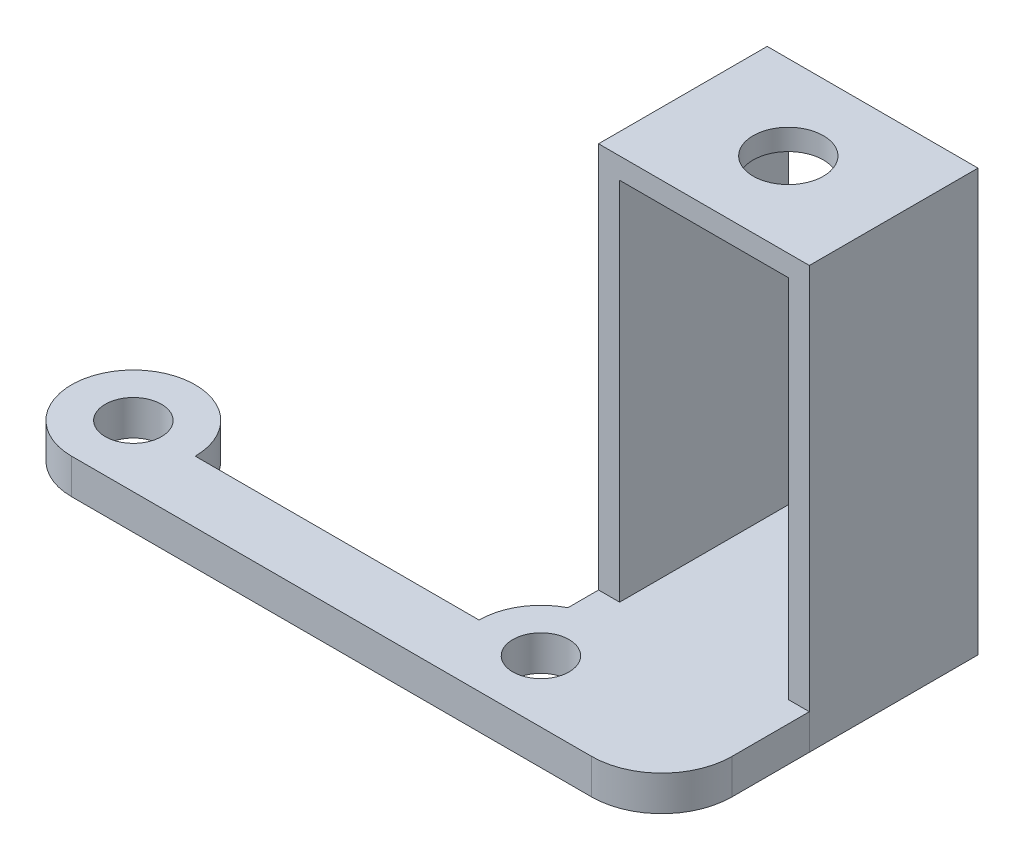
ISO-10303-21;
HEADER;
FILE_DESCRIPTION(('STEP AP214'),'2;1');
FILE_NAME('part.step','',(''),(''),'','','');
FILE_SCHEMA(('AUTOMOTIVE_DESIGN { 1 0 10303 214 1 1 1 1 }'));
ENDSEC;
DATA;
#1=APPLICATION_CONTEXT('core data for automotive mechanical design processes');
#2=APPLICATION_PROTOCOL_DEFINITION('international standard','automotive_design',2000,#1);
#3=PRODUCT_CONTEXT('',#1,'mechanical');
#4=PRODUCT('Part','Part','',(#3));
#5=PRODUCT_RELATED_PRODUCT_CATEGORY('part','',(#4));
#6=PRODUCT_DEFINITION_FORMATION('','',#4);
#7=PRODUCT_DEFINITION_CONTEXT('part definition',#1,'design');
#8=PRODUCT_DEFINITION('design','',#6,#7);
#9=PRODUCT_DEFINITION_SHAPE('','',#8);
#10=(LENGTH_UNIT() NAMED_UNIT(*) SI_UNIT(.MILLI.,.METRE.));
#11=(NAMED_UNIT(*) PLANE_ANGLE_UNIT() SI_UNIT($,.RADIAN.));
#12=(NAMED_UNIT(*) SI_UNIT($,.STERADIAN.) SOLID_ANGLE_UNIT());
#13=UNCERTAINTY_MEASURE_WITH_UNIT(LENGTH_MEASURE(1.E-05),#10,'distance_accuracy_value','');
#14=(GEOMETRIC_REPRESENTATION_CONTEXT(3) GLOBAL_UNCERTAINTY_ASSIGNED_CONTEXT((#13)) GLOBAL_UNIT_ASSIGNED_CONTEXT((#10,
#11,#12)) REPRESENTATION_CONTEXT('',''));
#15=CARTESIAN_POINT('',(0.,0.,0.));
#16=DIRECTION('',(0.,0.,1.));
#17=DIRECTION('',(1.,0.,0.));
#18=AXIS2_PLACEMENT_3D('',#15,#16,#17);
#19=CARTESIAN_POINT('',(55.,0.,-103.282039324994));
#20=DIRECTION('',(-1.,0.,0.));
#21=DIRECTION('',(0.,0.,1.));
#22=AXIS2_PLACEMENT_3D('',#19,#20,#21);
#23=PLANE('',#22);
#24=DIRECTION('',(0.,-1.,0.));
#25=VECTOR('',#24,1.);
#26=CARTESIAN_POINT('',(55.,0.,-36.2));
#27=LINE('',#26,#25);
#28=CARTESIAN_POINT('',(55.,60.,-36.2));
#29=VERTEX_POINT('',#28);
#30=CARTESIAN_POINT('',(55.,0.,-36.2));
#31=VERTEX_POINT('',#30);
#32=EDGE_CURVE('E144',#29,#31,#27,.T.);
#33=ORIENTED_EDGE('',*,*,#32,.F.);
#34=DIRECTION('',(0.,0.,1.));
#35=VECTOR('',#34,1.);
#36=CARTESIAN_POINT('',(55.,60.,-103.282039324994));
#37=LINE('',#36,#35);
#38=CARTESIAN_POINT('',(55.,60.,-12.2));
#39=VERTEX_POINT('',#38);
#40=EDGE_CURVE('E61',#29,#39,#37,.T.);
#41=ORIENTED_EDGE('',*,*,#40,.T.);
#42=DIRECTION('',(0.,-1.,0.));
#43=VECTOR('',#42,1.);
#44=CARTESIAN_POINT('',(55.,0.,-12.2));
#45=LINE('',#44,#43);
#46=CARTESIAN_POINT('',(55.,0.,-12.2));
#47=VERTEX_POINT('',#46);
#48=EDGE_CURVE('E152',#39,#47,#45,.T.);
#49=ORIENTED_EDGE('',*,*,#48,.T.);
#50=DIRECTION('',(0.,0.,1.));
#51=VECTOR('',#50,1.);
#52=CARTESIAN_POINT('',(55.,0.,-103.282039324994));
#53=LINE('',#52,#51);
#54=EDGE_CURVE('E100',#31,#47,#53,.T.);
#55=ORIENTED_EDGE('',*,*,#54,.F.);
#56=EDGE_LOOP('',(#33,#41,#49,#55));
#57=FACE_BOUND('',#56,.T.);
#58=ADVANCED_FACE('F44',(#57),#23,.F.);
#59=CARTESIAN_POINT('',(55.,0.,-103.282039324994));
#60=DIRECTION('',(0.,1.,0.));
#61=DIRECTION('',(0.,0.,1.));
#62=AXIS2_PLACEMENT_3D('',#59,#60,#61);
#63=PLANE('',#62);
#64=DIRECTION('',(-1.,0.,0.));
#65=VECTOR('',#64,1.);
#66=CARTESIAN_POINT('',(55.,0.,-36.2));
#67=LINE('',#66,#65);
#68=CARTESIAN_POINT('',(52.,0.,-36.2));
#69=VERTEX_POINT('',#68);
#70=EDGE_CURVE('E107',#31,#69,#67,.T.);
#71=ORIENTED_EDGE('',*,*,#70,.F.);
#72=ORIENTED_EDGE('',*,*,#54,.T.);
#73=DIRECTION('',(-1.,0.,0.));
#74=VECTOR('',#73,1.);
#75=CARTESIAN_POINT('',(55.,0.,-12.2));
#76=LINE('',#75,#74);
#77=CARTESIAN_POINT('',(52.,0.,-12.2));
#78=VERTEX_POINT('',#77);
#79=EDGE_CURVE('E151',#47,#78,#76,.T.);
#80=ORIENTED_EDGE('',*,*,#79,.T.);
#81=DIRECTION('',(0.,0.,1.));
#82=VECTOR('',#81,1.);
#83=CARTESIAN_POINT('',(52.,0.,-103.282039324994));
#84=LINE('',#83,#82);
#85=EDGE_CURVE('E153',#69,#78,#84,.T.);
#86=ORIENTED_EDGE('',*,*,#85,.F.);
#87=EDGE_LOOP('',(#71,#72,#80,#86));
#88=FACE_BOUND('',#87,.T.);
#89=ADVANCED_FACE('F185',(#88),#63,.F.);
#90=CARTESIAN_POINT('',(52.,57.,-103.282039324994));
#91=DIRECTION('',(1.,0.,0.));
#92=DIRECTION('',(0.,1.,0.));
#93=AXIS2_PLACEMENT_3D('',#90,#91,#92);
#94=PLANE('',#93);
#95=DIRECTION('',(0.,1.,0.));
#96=VECTOR('',#95,1.);
#97=CARTESIAN_POINT('',(52.,57.,-36.2));
#98=LINE('',#97,#96);
#99=CARTESIAN_POINT('',(52.,57.,-36.2));
#100=VERTEX_POINT('',#99);
#101=EDGE_CURVE('E140',#69,#100,#98,.T.);
#102=ORIENTED_EDGE('',*,*,#101,.F.);
#103=ORIENTED_EDGE('',*,*,#85,.T.);
#104=DIRECTION('',(0.,1.,0.));
#105=VECTOR('',#104,1.);
#106=CARTESIAN_POINT('',(52.,57.,-12.2));
#107=LINE('',#106,#105);
#108=CARTESIAN_POINT('',(52.,57.,-12.2));
#109=VERTEX_POINT('',#108);
#110=EDGE_CURVE('E155',#78,#109,#107,.T.);
#111=ORIENTED_EDGE('',*,*,#110,.T.);
#112=DIRECTION('',(0.,0.,1.));
#113=VECTOR('',#112,1.);
#114=CARTESIAN_POINT('',(52.,57.,-103.282039324994));
#115=LINE('',#114,#113);
#116=EDGE_CURVE('E156',#100,#109,#115,.T.);
#117=ORIENTED_EDGE('',*,*,#116,.F.);
#118=EDGE_LOOP('',(#102,#103,#111,#117));
#119=FACE_BOUND('',#118,.T.);
#120=ADVANCED_FACE('F193',(#119),#94,.F.);
#121=CARTESIAN_POINT('',(52.,57.,-103.282039324994));
#122=DIRECTION('',(0.,1.,0.));
#123=DIRECTION('',(0.,0.,1.));
#124=AXIS2_PLACEMENT_3D('',#121,#122,#123);
#125=PLANE('',#124);
#126=CARTESIAN_POINT('',(40.,57.,-24.2));
#127=DIRECTION('',(0.,-1.,0.));
#128=DIRECTION('',(0.,0.,-1.));
#129=AXIS2_PLACEMENT_3D('',#126,#127,#128);
#130=CIRCLE('',#129,5.);
#131=CARTESIAN_POINT('',(40.,57.,-29.2));
#132=VERTEX_POINT('',#131);
#133=EDGE_CURVE('E167',#132,#132,#130,.T.);
#134=ORIENTED_EDGE('',*,*,#133,.F.);
#135=EDGE_LOOP('',(#134));
#136=FACE_BOUND('',#135,.T.);
#137=DIRECTION('',(-1.,0.,0.));
#138=VECTOR('',#137,1.);
#139=CARTESIAN_POINT('',(52.,57.,-36.2));
#140=LINE('',#139,#138);
#141=CARTESIAN_POINT('',(28.,57.,-36.2));
#142=VERTEX_POINT('',#141);
#143=EDGE_CURVE('E135',#100,#142,#140,.T.);
#144=ORIENTED_EDGE('',*,*,#143,.F.);
#145=ORIENTED_EDGE('',*,*,#116,.T.);
#146=DIRECTION('',(-1.,0.,0.));
#147=VECTOR('',#146,1.);
#148=CARTESIAN_POINT('',(52.,57.,-12.2));
#149=LINE('',#148,#147);
#150=CARTESIAN_POINT('',(28.,57.,-12.2));
#151=VERTEX_POINT('',#150);
#152=EDGE_CURVE('E158',#109,#151,#149,.T.);
#153=ORIENTED_EDGE('',*,*,#152,.T.);
#154=DIRECTION('',(0.,0.,1.));
#155=VECTOR('',#154,1.);
#156=CARTESIAN_POINT('',(28.,57.,-103.282039324994));
#157=LINE('',#156,#155);
#158=EDGE_CURVE('E159',#142,#151,#157,.T.);
#159=ORIENTED_EDGE('',*,*,#158,.F.);
#160=EDGE_LOOP('',(#144,#145,#153,#159));
#161=FACE_BOUND('',#160,.T.);
#162=ADVANCED_FACE('F212',(#136,#161),#125,.F.);
#163=CARTESIAN_POINT('',(28.,57.,-103.282039324994));
#164=DIRECTION('',(-1.,0.,0.));
#165=DIRECTION('',(0.,-1.,0.));
#166=AXIS2_PLACEMENT_3D('',#163,#164,#165);
#167=PLANE('',#166);
#168=DIRECTION('',(0.,-1.,0.));
#169=VECTOR('',#168,1.);
#170=CARTESIAN_POINT('',(28.,57.,-36.2));
#171=LINE('',#170,#169);
#172=CARTESIAN_POINT('',(28.,0.,-36.2));
#173=VERTEX_POINT('',#172);
#174=EDGE_CURVE('E133',#142,#173,#171,.T.);
#175=ORIENTED_EDGE('',*,*,#174,.F.);
#176=ORIENTED_EDGE('',*,*,#158,.T.);
#177=DIRECTION('',(0.,-1.,0.));
#178=VECTOR('',#177,1.);
#179=CARTESIAN_POINT('',(28.,57.,-12.2));
#180=LINE('',#179,#178);
#181=CARTESIAN_POINT('',(28.,0.,-12.2));
#182=VERTEX_POINT('',#181);
#183=EDGE_CURVE('E161',#151,#182,#180,.T.);
#184=ORIENTED_EDGE('',*,*,#183,.T.);
#185=DIRECTION('',(0.,0.,1.));
#186=VECTOR('',#185,1.);
#187=CARTESIAN_POINT('',(28.,0.,-103.282039324994));
#188=LINE('',#187,#186);
#189=EDGE_CURVE('E162',#173,#182,#188,.T.);
#190=ORIENTED_EDGE('',*,*,#189,.F.);
#191=EDGE_LOOP('',(#175,#176,#184,#190));
#192=FACE_BOUND('',#191,.T.);
#193=ADVANCED_FACE('F215',(#192),#167,.F.);
#194=CARTESIAN_POINT('',(28.,0.,-103.282039324994));
#195=DIRECTION('',(0.,1.,0.));
#196=DIRECTION('',(0.,0.,1.));
#197=AXIS2_PLACEMENT_3D('',#194,#195,#196);
#198=PLANE('',#197);
#199=DIRECTION('',(-1.,0.,0.));
#200=VECTOR('',#199,1.);
#201=CARTESIAN_POINT('',(28.,0.,-36.2));
#202=LINE('',#201,#200);
#203=CARTESIAN_POINT('',(25.,0.,-36.2));
#204=VERTEX_POINT('',#203);
#205=EDGE_CURVE('E53',#173,#204,#202,.T.);
#206=ORIENTED_EDGE('',*,*,#205,.F.);
#207=ORIENTED_EDGE('',*,*,#189,.T.);
#208=DIRECTION('',(-1.,0.,0.));
#209=VECTOR('',#208,1.);
#210=CARTESIAN_POINT('',(28.,0.,-12.2));
#211=LINE('',#210,#209);
#212=CARTESIAN_POINT('',(25.,0.,-12.2));
#213=VERTEX_POINT('',#212);
#214=EDGE_CURVE('E127',#182,#213,#211,.T.);
#215=ORIENTED_EDGE('',*,*,#214,.T.);
#216=DIRECTION('',(0.,0.,1.));
#217=VECTOR('',#216,1.);
#218=CARTESIAN_POINT('',(25.,0.,-103.282039324994));
#219=LINE('',#218,#217);
#220=EDGE_CURVE('E118',#204,#213,#219,.T.);
#221=ORIENTED_EDGE('',*,*,#220,.F.);
#222=EDGE_LOOP('',(#206,#207,#215,#221));
#223=FACE_BOUND('',#222,.T.);
#224=ADVANCED_FACE('F124',(#223),#198,.F.);
#225=CARTESIAN_POINT('',(25.,0.,-103.282039324994));
#226=DIRECTION('',(1.,0.,0.));
#227=DIRECTION('',(0.,0.,-1.));
#228=AXIS2_PLACEMENT_3D('',#225,#226,#227);
#229=PLANE('',#228);
#230=DIRECTION('',(0.,1.,0.));
#231=VECTOR('',#230,1.);
#232=CARTESIAN_POINT('',(25.,0.,-36.2));
#233=LINE('',#232,#231);
#234=CARTESIAN_POINT('',(25.,60.,-36.2));
#235=VERTEX_POINT('',#234);
#236=EDGE_CURVE('E12',#204,#235,#233,.T.);
#237=ORIENTED_EDGE('',*,*,#236,.F.);
#238=ORIENTED_EDGE('',*,*,#220,.T.);
#239=DIRECTION('',(0.,1.,0.));
#240=VECTOR('',#239,1.);
#241=CARTESIAN_POINT('',(25.,0.,-12.2));
#242=LINE('',#241,#240);
#243=CARTESIAN_POINT('',(25.,60.,-12.2));
#244=VERTEX_POINT('',#243);
#245=EDGE_CURVE('E129',#213,#244,#242,.T.);
#246=ORIENTED_EDGE('',*,*,#245,.T.);
#247=DIRECTION('',(0.,0.,1.));
#248=VECTOR('',#247,1.);
#249=CARTESIAN_POINT('',(25.,60.,-103.282039324994));
#250=LINE('',#249,#248);
#251=EDGE_CURVE('E67',#235,#244,#250,.T.);
#252=ORIENTED_EDGE('',*,*,#251,.F.);
#253=EDGE_LOOP('',(#237,#238,#246,#252));
#254=FACE_BOUND('',#253,.T.);
#255=ADVANCED_FACE('F117',(#254),#229,.F.);
#256=CARTESIAN_POINT('',(55.,60.,-103.282039324994));
#257=DIRECTION('',(0.,-1.,0.));
#258=DIRECTION('',(0.,0.,-1.));
#259=AXIS2_PLACEMENT_3D('',#256,#257,#258);
#260=PLANE('',#259);
#261=CARTESIAN_POINT('',(40.,60.,-24.2));
#262=DIRECTION('',(0.,-1.,0.));
#263=DIRECTION('',(0.,0.,-1.));
#264=AXIS2_PLACEMENT_3D('',#261,#262,#263);
#265=CIRCLE('',#264,5.);
#266=CARTESIAN_POINT('',(40.,60.,-29.2));
#267=VERTEX_POINT('',#266);
#268=EDGE_CURVE('E48',#267,#267,#265,.T.);
#269=ORIENTED_EDGE('',*,*,#268,.T.);
#270=EDGE_LOOP('',(#269));
#271=FACE_BOUND('',#270,.T.);
#272=DIRECTION('',(1.,0.,0.));
#273=VECTOR('',#272,1.);
#274=CARTESIAN_POINT('',(55.,60.,-36.2));
#275=LINE('',#274,#273);
#276=EDGE_CURVE('E147',#235,#29,#275,.T.);
#277=ORIENTED_EDGE('',*,*,#276,.F.);
#278=ORIENTED_EDGE('',*,*,#251,.T.);
#279=DIRECTION('',(1.,0.,0.));
#280=VECTOR('',#279,1.);
#281=CARTESIAN_POINT('',(55.,60.,-12.2));
#282=LINE('',#281,#280);
#283=EDGE_CURVE('E149',#244,#39,#282,.T.);
#284=ORIENTED_EDGE('',*,*,#283,.T.);
#285=ORIENTED_EDGE('',*,*,#40,.F.);
#286=EDGE_LOOP('',(#277,#278,#284,#285));
#287=FACE_BOUND('',#286,.T.);
#288=ADVANCED_FACE('F195',(#271,#287),#260,.F.);
#289=CARTESIAN_POINT('',(0.,0.,-12.2));
#290=DIRECTION('',(0.,0.,1.));
#291=DIRECTION('',(1.,0.,0.));
#292=AXIS2_PLACEMENT_3D('',#289,#290,#291);
#293=PLANE('',#292);
#294=ORIENTED_EDGE('',*,*,#48,.F.);
#295=ORIENTED_EDGE('',*,*,#283,.F.);
#296=ORIENTED_EDGE('',*,*,#245,.F.);
#297=ORIENTED_EDGE('',*,*,#214,.F.);
#298=ORIENTED_EDGE('',*,*,#183,.F.);
#299=ORIENTED_EDGE('',*,*,#152,.F.);
#300=ORIENTED_EDGE('',*,*,#110,.F.);
#301=ORIENTED_EDGE('',*,*,#79,.F.);
#302=EDGE_LOOP('',(#294,#295,#296,#297,#298,#299,#300,#301));
#303=FACE_BOUND('',#302,.T.);
#304=ADVANCED_FACE('F189',(#303),#293,.T.);
#305=CARTESIAN_POINT('',(0.,59.0832691319598,-36.2));
#306=DIRECTION('',(0.,0.,-1.));
#307=DIRECTION('',(-1.,0.,0.));
#308=AXIS2_PLACEMENT_3D('',#305,#306,#307);
#309=PLANE('',#308);
#310=ORIENTED_EDGE('',*,*,#276,.T.);
#311=ORIENTED_EDGE('',*,*,#32,.T.);
#312=ORIENTED_EDGE('',*,*,#70,.T.);
#313=ORIENTED_EDGE('',*,*,#101,.T.);
#314=ORIENTED_EDGE('',*,*,#143,.T.);
#315=ORIENTED_EDGE('',*,*,#174,.T.);
#316=ORIENTED_EDGE('',*,*,#205,.T.);
#317=ORIENTED_EDGE('',*,*,#236,.T.);
#318=EDGE_LOOP('',(#310,#311,#312,#313,#314,#315,#316,#317));
#319=FACE_BOUND('',#318,.T.);
#320=ADVANCED_FACE('F46',(#319),#309,.T.);
#321=CARTESIAN_POINT('',(40.,62.,-24.2));
#322=DIRECTION('',(0.,-1.,0.));
#323=DIRECTION('',(0.,0.,-1.));
#324=AXIS2_PLACEMENT_3D('',#321,#322,#323);
#325=CYLINDRICAL_SURFACE('',#324,5.);
#326=ORIENTED_EDGE('',*,*,#133,.T.);
#327=EDGE_LOOP('',(#326));
#328=FACE_BOUND('',#327,.T.);
#329=ORIENTED_EDGE('',*,*,#268,.F.);
#330=EDGE_LOOP('',(#329));
#331=FACE_BOUND('',#330,.T.);
#332=ADVANCED_FACE('F245',(#328,#331),#325,.F.);
#333=CLOSED_SHELL('',(#58,#89,#120,#162,#193,#224,#255,#288,#304,#320,#332));
#334=MANIFOLD_SOLID_BREP('B2',#333);
#335=CARTESIAN_POINT('',(-29.,5.,0.));
#336=DIRECTION('',(0.,1.,0.));
#337=DIRECTION('',(0.,0.,1.));
#338=AXIS2_PLACEMENT_3D('',#335,#336,#337);
#339=PLANE('',#338);
#340=CARTESIAN_POINT('',(-29.,5.,0.));
#341=DIRECTION('',(0.,1.,0.));
#342=DIRECTION('',(0.,0.,1.));
#343=AXIS2_PLACEMENT_3D('',#340,#341,#342);
#344=CIRCLE('',#343,4.);
#345=CARTESIAN_POINT('',(-29.,5.,4.));
#346=VERTEX_POINT('',#345);
#347=EDGE_CURVE('E441',#346,#346,#344,.T.);
#348=ORIENTED_EDGE('',*,*,#347,.F.);
#349=EDGE_LOOP('',(#348));
#350=FACE_BOUND('',#349,.T.);
#351=DIRECTION('',(1.,0.,0.));
#352=VECTOR('',#351,1.);
#353=CARTESIAN_POINT('',(-29.,5.,8.8));
#354=LINE('',#353,#352);
#355=CARTESIAN_POINT('',(-29.,5.,8.8));
#356=VERTEX_POINT('',#355);
#357=CARTESIAN_POINT('',(45.,5.,8.8));
#358=VERTEX_POINT('',#357);
#359=EDGE_CURVE('E450',#356,#358,#354,.T.);
#360=ORIENTED_EDGE('',*,*,#359,.T.);
#361=CARTESIAN_POINT('',(45.,5.,-1.20000000000001));
#362=DIRECTION('',(0.,1.,0.));
#363=DIRECTION('',(0.,0.,1.));
#364=AXIS2_PLACEMENT_3D('',#361,#362,#363);
#365=CIRCLE('',#364,10.);
#366=CARTESIAN_POINT('',(55.,5.,-1.20000000000001));
#367=VERTEX_POINT('',#366);
#368=EDGE_CURVE('E42',#358,#367,#365,.T.);
#369=ORIENTED_EDGE('',*,*,#368,.T.);
#370=DIRECTION('',(0.,0.,-1.));
#371=VECTOR('',#370,1.);
#372=CARTESIAN_POINT('',(55.,5.,0.));
#373=LINE('',#372,#371);
#374=CARTESIAN_POINT('',(55.,5.,-12.2));
#375=VERTEX_POINT('',#374);
#376=EDGE_CURVE('E410',#367,#375,#373,.T.);
#377=ORIENTED_EDGE('',*,*,#376,.T.);
#378=DIRECTION('',(1.,0.,0.));
#379=VECTOR('',#378,1.);
#380=CARTESIAN_POINT('',(0.,5.,-12.2));
#381=LINE('',#380,#379);
#382=CARTESIAN_POINT('',(52.,5.,-12.2));
#383=VERTEX_POINT('',#382);
#384=EDGE_CURVE('E413',#383,#375,#381,.T.);
#385=ORIENTED_EDGE('',*,*,#384,.F.);
#386=DIRECTION('',(0.,0.,-1.));
#387=VECTOR('',#386,1.);
#388=CARTESIAN_POINT('',(52.,5.,0.));
#389=LINE('',#388,#387);
#390=CARTESIAN_POINT('',(52.,5.,-36.2));
#391=VERTEX_POINT('',#390);
#392=EDGE_CURVE('E412',#383,#391,#389,.T.);
#393=ORIENTED_EDGE('',*,*,#392,.T.);
#394=DIRECTION('',(1.,0.,0.));
#395=VECTOR('',#394,1.);
#396=CARTESIAN_POINT('',(0.,5.,-36.2));
#397=LINE('',#396,#395);
#398=CARTESIAN_POINT('',(28.,5.,-36.2));
#399=VERTEX_POINT('',#398);
#400=EDGE_CURVE('E420',#399,#391,#397,.T.);
#401=ORIENTED_EDGE('',*,*,#400,.F.);
#402=DIRECTION('',(0.,0.,-1.));
#403=VECTOR('',#402,1.);
#404=CARTESIAN_POINT('',(28.,5.,0.));
#405=LINE('',#404,#403);
#406=CARTESIAN_POINT('',(28.,5.,-12.2));
#407=VERTEX_POINT('',#406);
#408=EDGE_CURVE('E386',#407,#399,#405,.T.);
#409=ORIENTED_EDGE('',*,*,#408,.F.);
#410=DIRECTION('',(1.,0.,0.));
#411=VECTOR('',#410,1.);
#412=CARTESIAN_POINT('',(0.,5.,-12.2));
#413=LINE('',#412,#411);
#414=CARTESIAN_POINT('',(25.,5.,-12.2));
#415=VERTEX_POINT('',#414);
#416=EDGE_CURVE('E379',#415,#407,#413,.T.);
#417=ORIENTED_EDGE('',*,*,#416,.F.);
#418=DIRECTION('',(0.,0.,-1.));
#419=VECTOR('',#418,1.);
#420=CARTESIAN_POINT('',(25.,5.,0.));
#421=LINE('',#420,#419);
#422=CARTESIAN_POINT('',(25.,5.,-7.83836717690617));
#423=VERTEX_POINT('',#422);
#424=EDGE_CURVE('E383',#423,#415,#421,.T.);
#425=ORIENTED_EDGE('',*,*,#424,.F.);
#426=CARTESIAN_POINT('',(29.,5.,0.));
#427=DIRECTION('',(0.,1.,0.));
#428=DIRECTION('',(0.,0.,1.));
#429=AXIS2_PLACEMENT_3D('',#426,#427,#428);
#430=CIRCLE('',#429,8.8);
#431=CARTESIAN_POINT('',(20.2,5.,0.));
#432=VERTEX_POINT('',#431);
#433=EDGE_CURVE('E453',#423,#432,#430,.T.);
#434=ORIENTED_EDGE('',*,*,#433,.T.);
#435=DIRECTION('',(-1.,0.,0.));
#436=VECTOR('',#435,1.);
#437=CARTESIAN_POINT('',(-20.2,5.,0.));
#438=LINE('',#437,#436);
#439=CARTESIAN_POINT('',(-20.2,5.,0.));
#440=VERTEX_POINT('',#439);
#441=EDGE_CURVE('E455',#432,#440,#438,.T.);
#442=ORIENTED_EDGE('',*,*,#441,.T.);
#443=CARTESIAN_POINT('',(-29.,5.,0.));
#444=DIRECTION('',(0.,1.,0.));
#445=DIRECTION('',(0.,0.,1.));
#446=AXIS2_PLACEMENT_3D('',#443,#444,#445);
#447=CIRCLE('',#446,8.8);
#448=EDGE_CURVE('E447',#440,#356,#447,.T.);
#449=ORIENTED_EDGE('',*,*,#448,.T.);
#450=EDGE_LOOP('',(#360,#369,#377,#385,#393,#401,#409,#417,#425,#434,#442,#449));
#451=FACE_BOUND('',#450,.T.);
#452=CARTESIAN_POINT('',(29.,5.,0.));
#453=DIRECTION('',(0.,1.,0.));
#454=DIRECTION('',(0.,0.,1.));
#455=AXIS2_PLACEMENT_3D('',#452,#453,#454);
#456=CIRCLE('',#455,4.);
#457=CARTESIAN_POINT('',(29.,5.,4.));
#458=VERTEX_POINT('',#457);
#459=EDGE_CURVE('E435',#458,#458,#456,.T.);
#460=ORIENTED_EDGE('',*,*,#459,.F.);
#461=EDGE_LOOP('',(#460));
#462=FACE_BOUND('',#461,.T.);
#463=ADVANCED_FACE('F292',(#350,#451,#462),#339,.T.);
#464=CARTESIAN_POINT('',(-29.,0.,0.));
#465=DIRECTION('',(0.,1.,0.));
#466=DIRECTION('',(0.,0.,1.));
#467=AXIS2_PLACEMENT_3D('',#464,#465,#466);
#468=PLANE('',#467);
#469=DIRECTION('',(0.,0.,-1.));
#470=VECTOR('',#469,1.);
#471=CARTESIAN_POINT('',(55.,0.,0.));
#472=LINE('',#471,#470);
#473=CARTESIAN_POINT('',(55.,0.,-1.20000000000001));
#474=VERTEX_POINT('',#473);
#475=CARTESIAN_POINT('',(55.,0.,-12.2));
#476=VERTEX_POINT('',#475);
#477=EDGE_CURVE('E409',#474,#476,#472,.T.);
#478=ORIENTED_EDGE('',*,*,#477,.F.);
#479=CARTESIAN_POINT('',(45.,0.,-1.20000000000001));
#480=DIRECTION('',(0.,1.,0.));
#481=DIRECTION('',(0.,0.,1.));
#482=AXIS2_PLACEMENT_3D('',#479,#480,#481);
#483=CIRCLE('',#482,10.);
#484=CARTESIAN_POINT('',(45.,0.,8.8));
#485=VERTEX_POINT('',#484);
#486=EDGE_CURVE('E314',#474,#485,#483,.F.);
#487=ORIENTED_EDGE('',*,*,#486,.T.);
#488=DIRECTION('',(1.,0.,0.));
#489=VECTOR('',#488,1.);
#490=CARTESIAN_POINT('',(-29.,0.,8.8));
#491=LINE('',#490,#489);
#492=CARTESIAN_POINT('',(-29.,0.,8.8));
#493=VERTEX_POINT('',#492);
#494=EDGE_CURVE('E460',#493,#485,#491,.T.);
#495=ORIENTED_EDGE('',*,*,#494,.F.);
#496=CARTESIAN_POINT('',(-29.,0.,0.));
#497=DIRECTION('',(0.,1.,0.));
#498=DIRECTION('',(0.,0.,1.));
#499=AXIS2_PLACEMENT_3D('',#496,#497,#498);
#500=CIRCLE('',#499,8.8);
#501=CARTESIAN_POINT('',(-20.2,0.,0.));
#502=VERTEX_POINT('',#501);
#503=EDGE_CURVE('E444',#502,#493,#500,.T.);
#504=ORIENTED_EDGE('',*,*,#503,.F.);
#505=DIRECTION('',(-1.,0.,0.));
#506=VECTOR('',#505,1.);
#507=CARTESIAN_POINT('',(-20.2,0.,0.));
#508=LINE('',#507,#506);
#509=CARTESIAN_POINT('',(20.2,0.,0.));
#510=VERTEX_POINT('',#509);
#511=EDGE_CURVE('E451',#510,#502,#508,.T.);
#512=ORIENTED_EDGE('',*,*,#511,.F.);
#513=CARTESIAN_POINT('',(29.,0.,0.));
#514=DIRECTION('',(0.,1.,0.));
#515=DIRECTION('',(0.,0.,1.));
#516=AXIS2_PLACEMENT_3D('',#513,#514,#515);
#517=CIRCLE('',#516,8.8);
#518=CARTESIAN_POINT('',(25.,0.,-7.83836717690617));
#519=VERTEX_POINT('',#518);
#520=EDGE_CURVE('E462',#519,#510,#517,.T.);
#521=ORIENTED_EDGE('',*,*,#520,.F.);
#522=DIRECTION('',(0.,0.,-1.));
#523=VECTOR('',#522,1.);
#524=CARTESIAN_POINT('',(25.,0.,0.));
#525=LINE('',#524,#523);
#526=CARTESIAN_POINT('',(25.,0.,-12.2));
#527=VERTEX_POINT('',#526);
#528=EDGE_CURVE('E419',#519,#527,#525,.T.);
#529=ORIENTED_EDGE('',*,*,#528,.T.);
#530=DIRECTION('',(1.,0.,0.));
#531=VECTOR('',#530,1.);
#532=CARTESIAN_POINT('',(0.,0.,-12.2));
#533=LINE('',#532,#531);
#534=CARTESIAN_POINT('',(28.,0.,-12.2));
#535=VERTEX_POINT('',#534);
#536=EDGE_CURVE('E395',#527,#535,#533,.T.);
#537=ORIENTED_EDGE('',*,*,#536,.T.);
#538=DIRECTION('',(0.,0.,-1.));
#539=VECTOR('',#538,1.);
#540=CARTESIAN_POINT('',(28.,0.,0.));
#541=LINE('',#540,#539);
#542=CARTESIAN_POINT('',(28.,0.,-36.2));
#543=VERTEX_POINT('',#542);
#544=EDGE_CURVE('E535',#535,#543,#541,.T.);
#545=ORIENTED_EDGE('',*,*,#544,.T.);
#546=DIRECTION('',(1.,0.,0.));
#547=VECTOR('',#546,1.);
#548=CARTESIAN_POINT('',(0.,0.,-36.2));
#549=LINE('',#548,#547);
#550=CARTESIAN_POINT('',(52.,0.,-36.2));
#551=VERTEX_POINT('',#550);
#552=EDGE_CURVE('E405',#543,#551,#549,.T.);
#553=ORIENTED_EDGE('',*,*,#552,.T.);
#554=DIRECTION('',(0.,0.,-1.));
#555=VECTOR('',#554,1.);
#556=CARTESIAN_POINT('',(52.,0.,0.));
#557=LINE('',#556,#555);
#558=CARTESIAN_POINT('',(52.,0.,-12.2));
#559=VERTEX_POINT('',#558);
#560=EDGE_CURVE('E417',#559,#551,#557,.T.);
#561=ORIENTED_EDGE('',*,*,#560,.F.);
#562=DIRECTION('',(1.,0.,0.));
#563=VECTOR('',#562,1.);
#564=CARTESIAN_POINT('',(0.,0.,-12.2));
#565=LINE('',#564,#563);
#566=EDGE_CURVE('E402',#559,#476,#565,.T.);
#567=ORIENTED_EDGE('',*,*,#566,.T.);
#568=EDGE_LOOP('',(#478,#487,#495,#504,#512,#521,#529,#537,#545,#553,#561,#567));
#569=FACE_BOUND('',#568,.T.);
#570=CARTESIAN_POINT('',(-29.,0.,0.));
#571=DIRECTION('',(0.,1.,0.));
#572=DIRECTION('',(0.,0.,1.));
#573=AXIS2_PLACEMENT_3D('',#570,#571,#572);
#574=CIRCLE('',#573,4.);
#575=CARTESIAN_POINT('',(-29.,0.,4.));
#576=VERTEX_POINT('',#575);
#577=EDGE_CURVE('E438',#576,#576,#574,.T.);
#578=ORIENTED_EDGE('',*,*,#577,.T.);
#579=EDGE_LOOP('',(#578));
#580=FACE_BOUND('',#579,.T.);
#581=CARTESIAN_POINT('',(29.,0.,0.));
#582=DIRECTION('',(0.,1.,0.));
#583=DIRECTION('',(0.,0.,1.));
#584=AXIS2_PLACEMENT_3D('',#581,#582,#583);
#585=CIRCLE('',#584,4.);
#586=CARTESIAN_POINT('',(29.,0.,4.));
#587=VERTEX_POINT('',#586);
#588=EDGE_CURVE('E434',#587,#587,#585,.T.);
#589=ORIENTED_EDGE('',*,*,#588,.T.);
#590=EDGE_LOOP('',(#589));
#591=FACE_BOUND('',#590,.T.);
#592=ADVANCED_FACE('F483',(#569,#580,#591),#468,.F.);
#593=CARTESIAN_POINT('',(-29.,5.,0.));
#594=DIRECTION('',(0.,-1.,0.));
#595=DIRECTION('',(0.,0.,-1.));
#596=AXIS2_PLACEMENT_3D('',#593,#594,#595);
#597=CYLINDRICAL_SURFACE('',#596,8.8);
#598=ORIENTED_EDGE('',*,*,#503,.T.);
#599=DIRECTION('',(0.,-1.,0.));
#600=VECTOR('',#599,1.);
#601=CARTESIAN_POINT('',(-29.,5.,8.8));
#602=LINE('',#601,#600);
#603=EDGE_CURVE('E470',#356,#493,#602,.T.);
#604=ORIENTED_EDGE('',*,*,#603,.F.);
#605=ORIENTED_EDGE('',*,*,#448,.F.);
#606=DIRECTION('',(0.,-1.,0.));
#607=VECTOR('',#606,1.);
#608=CARTESIAN_POINT('',(-20.2,5.,0.));
#609=LINE('',#608,#607);
#610=EDGE_CURVE('E457',#440,#502,#609,.T.);
#611=ORIENTED_EDGE('',*,*,#610,.T.);
#612=EDGE_LOOP('',(#598,#604,#605,#611));
#613=FACE_BOUND('',#612,.T.);
#614=ADVANCED_FACE('F505',(#613),#597,.T.);
#615=CARTESIAN_POINT('',(-29.,5.,8.8));
#616=DIRECTION('',(0.,0.,-1.));
#617=DIRECTION('',(-1.,0.,0.));
#618=AXIS2_PLACEMENT_3D('',#615,#616,#617);
#619=PLANE('',#618);
#620=ORIENTED_EDGE('',*,*,#494,.T.);
#621=DIRECTION('',(0.,-1.,0.));
#622=VECTOR('',#621,1.);
#623=CARTESIAN_POINT('',(45.,5.,8.8));
#624=LINE('',#623,#622);
#625=EDGE_CURVE('E300',#485,#358,#624,.F.);
#626=ORIENTED_EDGE('',*,*,#625,.T.);
#627=ORIENTED_EDGE('',*,*,#359,.F.);
#628=ORIENTED_EDGE('',*,*,#603,.T.);
#629=EDGE_LOOP('',(#620,#626,#627,#628));
#630=FACE_BOUND('',#629,.T.);
#631=ADVANCED_FACE('F519',(#630),#619,.F.);
#632=CARTESIAN_POINT('',(29.,5.,0.));
#633=DIRECTION('',(0.,-1.,0.));
#634=DIRECTION('',(0.,0.,-1.));
#635=AXIS2_PLACEMENT_3D('',#632,#633,#634);
#636=CYLINDRICAL_SURFACE('',#635,8.8);
#637=ORIENTED_EDGE('',*,*,#433,.F.);
#638=DIRECTION('',(0.,-1.,0.));
#639=VECTOR('',#638,1.);
#640=CARTESIAN_POINT('',(25.,59.0832691319598,-7.83836717690617));
#641=LINE('',#640,#639);
#642=EDGE_CURVE('E401',#423,#519,#641,.T.);
#643=ORIENTED_EDGE('',*,*,#642,.T.);
#644=ORIENTED_EDGE('',*,*,#520,.T.);
#645=DIRECTION('',(0.,-1.,0.));
#646=VECTOR('',#645,1.);
#647=CARTESIAN_POINT('',(20.2,5.,0.));
#648=LINE('',#647,#646);
#649=EDGE_CURVE('E467',#432,#510,#648,.T.);
#650=ORIENTED_EDGE('',*,*,#649,.F.);
#651=EDGE_LOOP('',(#637,#643,#644,#650));
#652=FACE_BOUND('',#651,.T.);
#653=ADVANCED_FACE('F515',(#652),#636,.T.);
#654=CARTESIAN_POINT('',(-20.2,5.,0.));
#655=DIRECTION('',(0.,0.,1.));
#656=DIRECTION('',(1.,0.,0.));
#657=AXIS2_PLACEMENT_3D('',#654,#655,#656);
#658=PLANE('',#657);
#659=ORIENTED_EDGE('',*,*,#511,.T.);
#660=ORIENTED_EDGE('',*,*,#610,.F.);
#661=ORIENTED_EDGE('',*,*,#441,.F.);
#662=ORIENTED_EDGE('',*,*,#649,.T.);
#663=EDGE_LOOP('',(#659,#660,#661,#662));
#664=FACE_BOUND('',#663,.T.);
#665=ADVANCED_FACE('F512',(#664),#658,.F.);
#666=CARTESIAN_POINT('',(-29.,5.,0.));
#667=DIRECTION('',(0.,-1.,0.));
#668=DIRECTION('',(0.,0.,-1.));
#669=AXIS2_PLACEMENT_3D('',#666,#667,#668);
#670=CYLINDRICAL_SURFACE('',#669,4.);
#671=ORIENTED_EDGE('',*,*,#347,.T.);
#672=EDGE_LOOP('',(#671));
#673=FACE_BOUND('',#672,.T.);
#674=ORIENTED_EDGE('',*,*,#577,.F.);
#675=EDGE_LOOP('',(#674));
#676=FACE_BOUND('',#675,.T.);
#677=ADVANCED_FACE('F509',(#673,#676),#670,.F.);
#678=CARTESIAN_POINT('',(29.,5.,0.));
#679=DIRECTION('',(0.,-1.,0.));
#680=DIRECTION('',(0.,0.,-1.));
#681=AXIS2_PLACEMENT_3D('',#678,#679,#680);
#682=CYLINDRICAL_SURFACE('',#681,4.);
#683=ORIENTED_EDGE('',*,*,#459,.T.);
#684=EDGE_LOOP('',(#683));
#685=FACE_BOUND('',#684,.T.);
#686=ORIENTED_EDGE('',*,*,#588,.F.);
#687=EDGE_LOOP('',(#686));
#688=FACE_BOUND('',#687,.T.);
#689=ADVANCED_FACE('F561',(#685,#688),#682,.F.);
#690=CARTESIAN_POINT('',(25.,59.0832691319598,0.));
#691=DIRECTION('',(-1.,0.,0.));
#692=DIRECTION('',(0.,0.,1.));
#693=AXIS2_PLACEMENT_3D('',#690,#691,#692);
#694=PLANE('',#693);
#695=ORIENTED_EDGE('',*,*,#642,.F.);
#696=ORIENTED_EDGE('',*,*,#424,.T.);
#697=DIRECTION('',(0.,-1.,0.));
#698=VECTOR('',#697,1.);
#699=CARTESIAN_POINT('',(25.,59.0832691319598,-12.2));
#700=LINE('',#699,#698);
#701=EDGE_CURVE('E390',#415,#527,#700,.T.);
#702=ORIENTED_EDGE('',*,*,#701,.T.);
#703=ORIENTED_EDGE('',*,*,#528,.F.);
#704=EDGE_LOOP('',(#695,#696,#702,#703));
#705=FACE_BOUND('',#704,.T.);
#706=ADVANCED_FACE('F400',(#705),#694,.T.);
#707=CARTESIAN_POINT('',(0.,59.0832691319598,-12.2));
#708=DIRECTION('',(0.,0.,-1.));
#709=DIRECTION('',(-1.,0.,0.));
#710=AXIS2_PLACEMENT_3D('',#707,#708,#709);
#711=PLANE('',#710);
#712=ORIENTED_EDGE('',*,*,#701,.F.);
#713=ORIENTED_EDGE('',*,*,#416,.T.);
#714=DIRECTION('',(0.,-1.,0.));
#715=VECTOR('',#714,1.);
#716=CARTESIAN_POINT('',(28.,59.0832691319598,-12.2));
#717=LINE('',#716,#715);
#718=EDGE_CURVE('E389',#407,#535,#717,.T.);
#719=ORIENTED_EDGE('',*,*,#718,.T.);
#720=ORIENTED_EDGE('',*,*,#536,.F.);
#721=EDGE_LOOP('',(#712,#713,#719,#720));
#722=FACE_BOUND('',#721,.T.);
#723=ADVANCED_FACE('F393',(#722),#711,.T.);
#724=CARTESIAN_POINT('',(28.,59.0832691319598,0.));
#725=DIRECTION('',(-1.,0.,0.));
#726=DIRECTION('',(0.,0.,1.));
#727=AXIS2_PLACEMENT_3D('',#724,#725,#726);
#728=PLANE('',#727);
#729=ORIENTED_EDGE('',*,*,#718,.F.);
#730=ORIENTED_EDGE('',*,*,#408,.T.);
#731=DIRECTION('',(0.,-1.,0.));
#732=VECTOR('',#731,1.);
#733=CARTESIAN_POINT('',(28.,59.0832691319598,-36.2));
#734=LINE('',#733,#732);
#735=EDGE_CURVE('E424',#399,#543,#734,.T.);
#736=ORIENTED_EDGE('',*,*,#735,.T.);
#737=ORIENTED_EDGE('',*,*,#544,.F.);
#738=EDGE_LOOP('',(#729,#730,#736,#737));
#739=FACE_BOUND('',#738,.T.);
#740=ADVANCED_FACE('F549',(#739),#728,.T.);
#741=CARTESIAN_POINT('',(0.,59.0832691319598,-36.2));
#742=DIRECTION('',(0.,0.,-1.));
#743=DIRECTION('',(-1.,0.,0.));
#744=AXIS2_PLACEMENT_3D('',#741,#742,#743);
#745=PLANE('',#744);
#746=ORIENTED_EDGE('',*,*,#735,.F.);
#747=ORIENTED_EDGE('',*,*,#400,.T.);
#748=DIRECTION('',(0.,-1.,0.));
#749=VECTOR('',#748,1.);
#750=CARTESIAN_POINT('',(52.,59.0832691319598,-36.2));
#751=LINE('',#750,#749);
#752=EDGE_CURVE('E423',#391,#551,#751,.T.);
#753=ORIENTED_EDGE('',*,*,#752,.T.);
#754=ORIENTED_EDGE('',*,*,#552,.F.);
#755=EDGE_LOOP('',(#746,#747,#753,#754));
#756=FACE_BOUND('',#755,.T.);
#757=ADVANCED_FACE('F547',(#756),#745,.T.);
#758=CARTESIAN_POINT('',(52.,59.0832691319598,0.));
#759=DIRECTION('',(-1.,0.,0.));
#760=DIRECTION('',(0.,0.,1.));
#761=AXIS2_PLACEMENT_3D('',#758,#759,#760);
#762=PLANE('',#761);
#763=ORIENTED_EDGE('',*,*,#392,.F.);
#764=DIRECTION('',(0.,-1.,0.));
#765=VECTOR('',#764,1.);
#766=CARTESIAN_POINT('',(52.,59.0832691319598,-12.2));
#767=LINE('',#766,#765);
#768=EDGE_CURVE('E428',#383,#559,#767,.T.);
#769=ORIENTED_EDGE('',*,*,#768,.T.);
#770=ORIENTED_EDGE('',*,*,#560,.T.);
#771=ORIENTED_EDGE('',*,*,#752,.F.);
#772=EDGE_LOOP('',(#763,#769,#770,#771));
#773=FACE_BOUND('',#772,.T.);
#774=ADVANCED_FACE('F542',(#773),#762,.F.);
#775=CARTESIAN_POINT('',(0.,59.0832691319598,-12.2));
#776=DIRECTION('',(0.,0.,-1.));
#777=DIRECTION('',(-1.,0.,0.));
#778=AXIS2_PLACEMENT_3D('',#775,#776,#777);
#779=PLANE('',#778);
#780=ORIENTED_EDGE('',*,*,#768,.F.);
#781=ORIENTED_EDGE('',*,*,#384,.T.);
#782=DIRECTION('',(0.,-1.,0.));
#783=VECTOR('',#782,1.);
#784=CARTESIAN_POINT('',(55.,59.0832691319598,-12.2));
#785=LINE('',#784,#783);
#786=EDGE_CURVE('E416',#375,#476,#785,.T.);
#787=ORIENTED_EDGE('',*,*,#786,.T.);
#788=ORIENTED_EDGE('',*,*,#566,.F.);
#789=EDGE_LOOP('',(#780,#781,#787,#788));
#790=FACE_BOUND('',#789,.T.);
#791=ADVANCED_FACE('F491',(#790),#779,.T.);
#792=CARTESIAN_POINT('',(55.,59.0832691319598,0.));
#793=DIRECTION('',(-1.,0.,0.));
#794=DIRECTION('',(0.,0.,1.));
#795=AXIS2_PLACEMENT_3D('',#792,#793,#794);
#796=PLANE('',#795);
#797=ORIENTED_EDGE('',*,*,#376,.F.);
#798=DIRECTION('',(0.,-1.,0.));
#799=VECTOR('',#798,1.);
#800=CARTESIAN_POINT('',(55.,59.0832691319598,-1.20000000000001));
#801=LINE('',#800,#799);
#802=EDGE_CURVE('E473',#367,#474,#801,.T.);
#803=ORIENTED_EDGE('',*,*,#802,.T.);
#804=ORIENTED_EDGE('',*,*,#477,.T.);
#805=ORIENTED_EDGE('',*,*,#786,.F.);
#806=EDGE_LOOP('',(#797,#803,#804,#805));
#807=FACE_BOUND('',#806,.T.);
#808=ADVANCED_FACE('F479',(#807),#796,.F.);
#809=CARTESIAN_POINT('',(45.,59.0832691319598,-1.20000000000001));
#810=DIRECTION('',(0.,-1.,0.));
#811=DIRECTION('',(0.,0.,-1.));
#812=AXIS2_PLACEMENT_3D('',#809,#810,#811);
#813=CYLINDRICAL_SURFACE('',#812,10.);
#814=ORIENTED_EDGE('',*,*,#368,.F.);
#815=ORIENTED_EDGE('',*,*,#625,.F.);
#816=ORIENTED_EDGE('',*,*,#486,.F.);
#817=ORIENTED_EDGE('',*,*,#802,.F.);
#818=EDGE_LOOP('',(#814,#815,#816,#817));
#819=FACE_BOUND('',#818,.T.);
#820=ADVANCED_FACE('F294',(#819),#813,.T.);
#821=CLOSED_SHELL('',(#463,#592,#614,#631,#653,#665,#677,#689,#706,#723,#740,#757,#774,#791,
#808,#820));
#822=MANIFOLD_SOLID_BREP('B6',#821);
#823=ADVANCED_BREP_SHAPE_REPRESENTATION('',(#18,#334,#822),#14);
#824=SHAPE_DEFINITION_REPRESENTATION(#9,#823);
ENDSEC;
END-ISO-10303-21;
